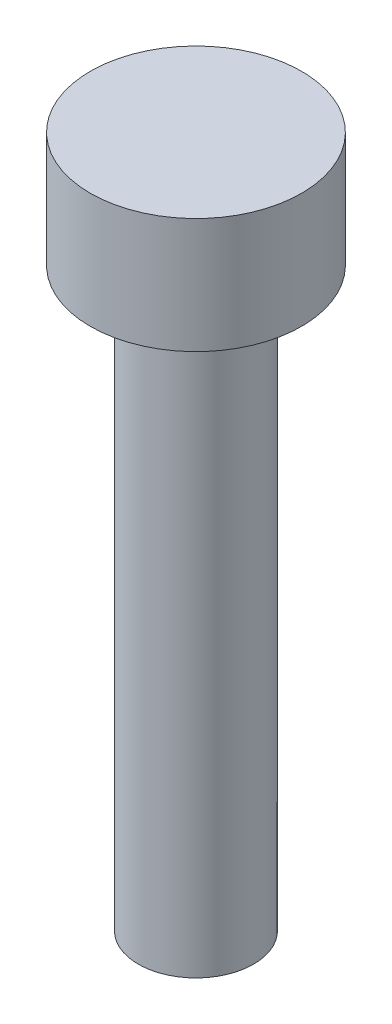
ISO-10303-21;
HEADER;
FILE_DESCRIPTION(('STEP AP214'),'2;1');
FILE_NAME('part.step','',(''),(''),'','','');
FILE_SCHEMA(('AUTOMOTIVE_DESIGN { 1 0 10303 214 1 1 1 1 }'));
ENDSEC;
DATA;
#1=APPLICATION_CONTEXT('core data for automotive mechanical design processes');
#2=APPLICATION_PROTOCOL_DEFINITION('international standard','automotive_design',2000,#1);
#3=PRODUCT_CONTEXT('',#1,'mechanical');
#4=PRODUCT('Part','Part','',(#3));
#5=PRODUCT_RELATED_PRODUCT_CATEGORY('part','',(#4));
#6=PRODUCT_DEFINITION_FORMATION('','',#4);
#7=PRODUCT_DEFINITION_CONTEXT('part definition',#1,'design');
#8=PRODUCT_DEFINITION('design','',#6,#7);
#9=PRODUCT_DEFINITION_SHAPE('','',#8);
#10=(LENGTH_UNIT() NAMED_UNIT(*) SI_UNIT(.MILLI.,.METRE.));
#11=(NAMED_UNIT(*) PLANE_ANGLE_UNIT() SI_UNIT($,.RADIAN.));
#12=(NAMED_UNIT(*) SI_UNIT($,.STERADIAN.) SOLID_ANGLE_UNIT());
#13=UNCERTAINTY_MEASURE_WITH_UNIT(LENGTH_MEASURE(1.E-05),#10,'distance_accuracy_value','');
#14=(GEOMETRIC_REPRESENTATION_CONTEXT(3) GLOBAL_UNCERTAINTY_ASSIGNED_CONTEXT((#13)) GLOBAL_UNIT_ASSIGNED_CONTEXT((#10,
#11,#12)) REPRESENTATION_CONTEXT('',''));
#15=CARTESIAN_POINT('',(0.,0.,0.));
#16=DIRECTION('',(0.,0.,1.));
#17=DIRECTION('',(1.,0.,0.));
#18=AXIS2_PLACEMENT_3D('',#15,#16,#17);
#19=CARTESIAN_POINT('',(0.,3.,0.));
#20=DIRECTION('',(0.,-1.,0.));
#21=DIRECTION('',(0.,0.,-1.));
#22=AXIS2_PLACEMENT_3D('',#19,#20,#21);
#23=CYLINDRICAL_SURFACE('',#22,2.75);
#24=CARTESIAN_POINT('',(0.,3.,0.));
#25=DIRECTION('',(0.,1.,0.));
#26=DIRECTION('',(0.,0.,1.));
#27=AXIS2_PLACEMENT_3D('',#24,#25,#26);
#28=CIRCLE('',#27,2.75);
#29=CARTESIAN_POINT('',(0.,3.,2.75));
#30=VERTEX_POINT('',#29);
#31=EDGE_CURVE('E38',#30,#30,#28,.T.);
#32=ORIENTED_EDGE('',*,*,#31,.F.);
#33=EDGE_LOOP('',(#32));
#34=FACE_BOUND('',#33,.T.);
#35=CARTESIAN_POINT('',(0.,0.,0.));
#36=DIRECTION('',(0.,1.,0.));
#37=DIRECTION('',(0.,0.,1.));
#38=AXIS2_PLACEMENT_3D('',#35,#36,#37);
#39=CIRCLE('',#38,2.75);
#40=CARTESIAN_POINT('',(0.,0.,2.75));
#41=VERTEX_POINT('',#40);
#42=EDGE_CURVE('E34',#41,#41,#39,.T.);
#43=ORIENTED_EDGE('',*,*,#42,.T.);
#44=EDGE_LOOP('',(#43));
#45=FACE_BOUND('',#44,.T.);
#46=ADVANCED_FACE('F31',(#34,#45),#23,.T.);
#47=CARTESIAN_POINT('',(0.,3.,0.));
#48=DIRECTION('',(0.,1.,0.));
#49=DIRECTION('',(0.,0.,1.));
#50=AXIS2_PLACEMENT_3D('',#47,#48,#49);
#51=PLANE('',#50);
#52=ORIENTED_EDGE('',*,*,#31,.T.);
#53=EDGE_LOOP('',(#52));
#54=FACE_BOUND('',#53,.T.);
#55=ADVANCED_FACE('F55',(#54),#51,.T.);
#56=CARTESIAN_POINT('',(0.,0.,0.));
#57=DIRECTION('',(0.,1.,0.));
#58=DIRECTION('',(0.,0.,1.));
#59=AXIS2_PLACEMENT_3D('',#56,#57,#58);
#60=PLANE('',#59);
#61=CARTESIAN_POINT('',(0.,0.,0.));
#62=DIRECTION('',(0.,-1.,0.));
#63=DIRECTION('',(0.,0.,-1.));
#64=AXIS2_PLACEMENT_3D('',#61,#62,#63);
#65=CIRCLE('',#64,1.5);
#66=CARTESIAN_POINT('',(0.,0.,-1.5));
#67=VERTEX_POINT('',#66);
#68=EDGE_CURVE('E10',#67,#67,#65,.T.);
#69=ORIENTED_EDGE('',*,*,#68,.F.);
#70=EDGE_LOOP('',(#69));
#71=FACE_BOUND('',#70,.T.);
#72=ORIENTED_EDGE('',*,*,#42,.F.);
#73=EDGE_LOOP('',(#72));
#74=FACE_BOUND('',#73,.T.);
#75=ADVANCED_FACE('F52',(#71,#74),#60,.F.);
#76=CARTESIAN_POINT('',(0.,-15.,0.));
#77=DIRECTION('',(0.,1.,0.));
#78=DIRECTION('',(0.,0.,1.));
#79=AXIS2_PLACEMENT_3D('',#76,#77,#78);
#80=CYLINDRICAL_SURFACE('',#79,1.5);
#81=CARTESIAN_POINT('',(0.,-15.,0.));
#82=DIRECTION('',(0.,-1.,0.));
#83=DIRECTION('',(0.,0.,-1.));
#84=AXIS2_PLACEMENT_3D('',#81,#82,#83);
#85=CIRCLE('',#84,1.5);
#86=CARTESIAN_POINT('',(0.,-15.,-1.5));
#87=VERTEX_POINT('',#86);
#88=EDGE_CURVE('E44',#87,#87,#85,.T.);
#89=ORIENTED_EDGE('',*,*,#88,.F.);
#90=EDGE_LOOP('',(#89));
#91=FACE_BOUND('',#90,.T.);
#92=ORIENTED_EDGE('',*,*,#68,.T.);
#93=EDGE_LOOP('',(#92));
#94=FACE_BOUND('',#93,.T.);
#95=ADVANCED_FACE('F54',(#91,#94),#80,.T.);
#96=CARTESIAN_POINT('',(0.,-15.,0.));
#97=DIRECTION('',(0.,-1.,0.));
#98=DIRECTION('',(0.,0.,-1.));
#99=AXIS2_PLACEMENT_3D('',#96,#97,#98);
#100=PLANE('',#99);
#101=ORIENTED_EDGE('',*,*,#88,.T.);
#102=EDGE_LOOP('',(#101));
#103=FACE_BOUND('',#102,.T.);
#104=ADVANCED_FACE('F61',(#103),#100,.T.);
#105=CLOSED_SHELL('',(#46,#55,#75,#95,#104));
#106=MANIFOLD_SOLID_BREP('B2',#105);
#107=ADVANCED_BREP_SHAPE_REPRESENTATION('',(#18,#106),#14);
#108=SHAPE_DEFINITION_REPRESENTATION(#9,#107);
ENDSEC;
END-ISO-10303-21;
